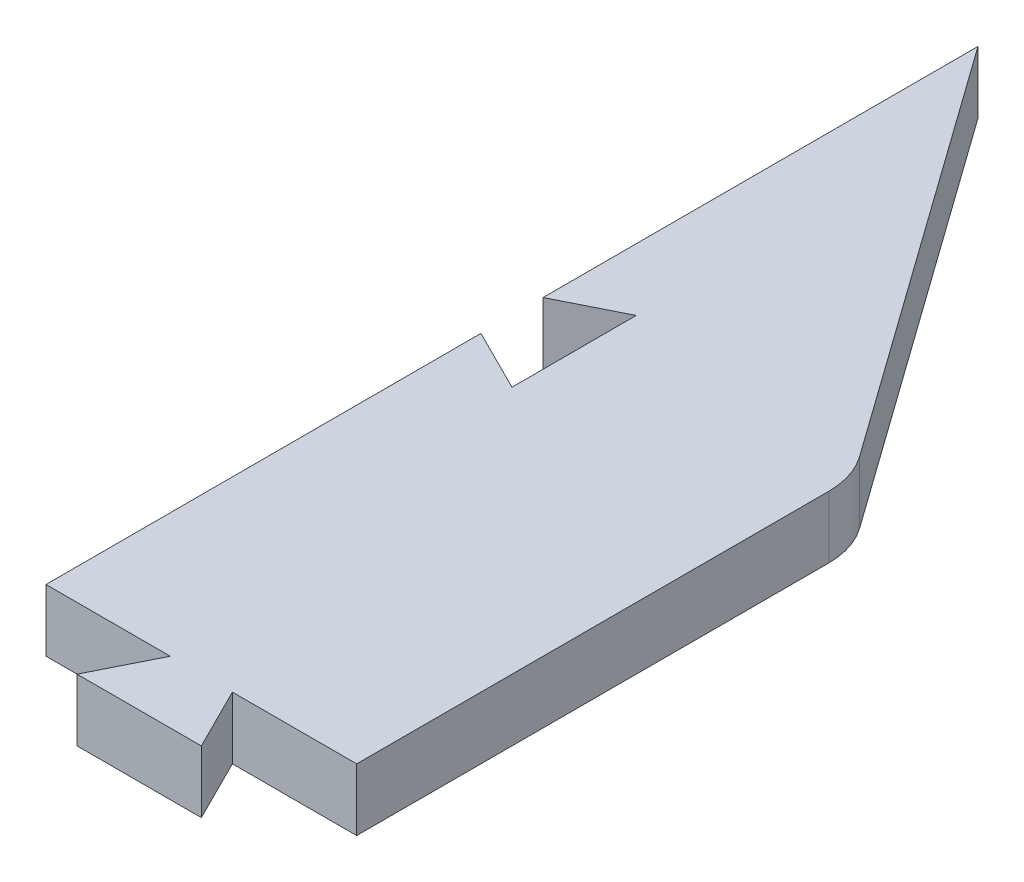
ISO-10303-21;
HEADER;
FILE_DESCRIPTION(('STEP AP214'),'2;1');
FILE_NAME('part.step','',(''),(''),'','','');
FILE_SCHEMA(('AUTOMOTIVE_DESIGN { 1 0 10303 214 1 1 1 1 }'));
ENDSEC;
DATA;
#1=APPLICATION_CONTEXT('core data for automotive mechanical design processes');
#2=APPLICATION_PROTOCOL_DEFINITION('international standard','automotive_design',2000,#1);
#3=PRODUCT_CONTEXT('',#1,'mechanical');
#4=PRODUCT('Part','Part','',(#3));
#5=PRODUCT_RELATED_PRODUCT_CATEGORY('part','',(#4));
#6=PRODUCT_DEFINITION_FORMATION('','',#4);
#7=PRODUCT_DEFINITION_CONTEXT('part definition',#1,'design');
#8=PRODUCT_DEFINITION('design','',#6,#7);
#9=PRODUCT_DEFINITION_SHAPE('','',#8);
#10=(LENGTH_UNIT() NAMED_UNIT(*) SI_UNIT(.MILLI.,.METRE.));
#11=(NAMED_UNIT(*) PLANE_ANGLE_UNIT() SI_UNIT($,.RADIAN.));
#12=(NAMED_UNIT(*) SI_UNIT($,.STERADIAN.) SOLID_ANGLE_UNIT());
#13=UNCERTAINTY_MEASURE_WITH_UNIT(LENGTH_MEASURE(1.E-05),#10,'distance_accuracy_value','');
#14=(GEOMETRIC_REPRESENTATION_CONTEXT(3) GLOBAL_UNCERTAINTY_ASSIGNED_CONTEXT((#13)) GLOBAL_UNIT_ASSIGNED_CONTEXT((#10,
#11,#12)) REPRESENTATION_CONTEXT('',''));
#15=CARTESIAN_POINT('',(0.,0.,0.));
#16=DIRECTION('',(0.,0.,1.));
#17=DIRECTION('',(1.,0.,0.));
#18=AXIS2_PLACEMENT_3D('',#15,#16,#17);
#19=CARTESIAN_POINT('',(14.,4.,-16.5000000000001));
#20=DIRECTION('',(0.447213595499949,0.,0.89442719099992));
#21=DIRECTION('',(0.89442719099992,0.,-0.447213595499949));
#22=AXIS2_PLACEMENT_3D('',#19,#20,#21);
#23=PLANE('',#22);
#24=DIRECTION('',(-0.89442719099992,0.,0.447213595499949));
#25=VECTOR('',#24,1.);
#26=CARTESIAN_POINT('',(14.,0.,-16.5000000000001));
#27=LINE('',#26,#25);
#28=CARTESIAN_POINT('',(14.,0.,-16.5000000000001));
#29=VERTEX_POINT('',#28);
#30=CARTESIAN_POINT('',(9.99999999999999,0.,-14.5000000000001));
#31=VERTEX_POINT('',#30);
#32=EDGE_CURVE('E164',#29,#31,#27,.T.);
#33=ORIENTED_EDGE('',*,*,#32,.F.);
#34=DIRECTION('',(0.,-1.,0.));
#35=VECTOR('',#34,1.);
#36=CARTESIAN_POINT('',(14.,4.,-16.5000000000001));
#37=LINE('',#36,#35);
#38=CARTESIAN_POINT('',(14.,4.,-16.5000000000001));
#39=VERTEX_POINT('',#38);
#40=EDGE_CURVE('E11',#39,#29,#37,.T.);
#41=ORIENTED_EDGE('',*,*,#40,.F.);
#42=DIRECTION('',(-0.89442719099992,0.,0.447213595499949));
#43=VECTOR('',#42,1.);
#44=CARTESIAN_POINT('',(14.,4.,-16.5000000000001));
#45=LINE('',#44,#43);
#46=CARTESIAN_POINT('',(9.99999999999999,4.,-14.5000000000001));
#47=VERTEX_POINT('',#46);
#48=EDGE_CURVE('E193',#39,#47,#45,.T.);
#49=ORIENTED_EDGE('',*,*,#48,.T.);
#50=DIRECTION('',(0.,-1.,0.));
#51=VECTOR('',#50,1.);
#52=CARTESIAN_POINT('',(9.99999999999999,4.,-14.5000000000001));
#53=LINE('',#52,#51);
#54=EDGE_CURVE('E38',#47,#31,#53,.T.);
#55=ORIENTED_EDGE('',*,*,#54,.T.);
#56=EDGE_LOOP('',(#33,#41,#49,#55));
#57=FACE_BOUND('',#56,.T.);
#58=ADVANCED_FACE('F35',(#57),#23,.T.);
#59=CARTESIAN_POINT('',(14.,4.,-16.5000000000001));
#60=DIRECTION('',(1.,0.,0.));
#61=DIRECTION('',(0.,0.,-1.));
#62=AXIS2_PLACEMENT_3D('',#59,#60,#61);
#63=PLANE('',#62);
#64=DIRECTION('',(0.,0.,1.));
#65=VECTOR('',#64,1.);
#66=CARTESIAN_POINT('',(14.,0.,-16.5000000000001));
#67=LINE('',#66,#65);
#68=CARTESIAN_POINT('',(14.,0.,-8.49999999999993));
#69=VERTEX_POINT('',#68);
#70=EDGE_CURVE('E95',#29,#69,#67,.T.);
#71=ORIENTED_EDGE('',*,*,#70,.T.);
#72=DIRECTION('',(0.,-1.,0.));
#73=VECTOR('',#72,1.);
#74=CARTESIAN_POINT('',(14.,4.,-8.49999999999993));
#75=LINE('',#74,#73);
#76=CARTESIAN_POINT('',(14.,4.,-8.49999999999993));
#77=VERTEX_POINT('',#76);
#78=EDGE_CURVE('E44',#77,#69,#75,.T.);
#79=ORIENTED_EDGE('',*,*,#78,.F.);
#80=DIRECTION('',(0.,0.,1.));
#81=VECTOR('',#80,1.);
#82=CARTESIAN_POINT('',(14.,4.,-16.5000000000001));
#83=LINE('',#82,#81);
#84=EDGE_CURVE('E143',#39,#77,#83,.T.);
#85=ORIENTED_EDGE('',*,*,#84,.F.);
#86=ORIENTED_EDGE('',*,*,#40,.T.);
#87=EDGE_LOOP('',(#71,#79,#85,#86));
#88=FACE_BOUND('',#87,.T.);
#89=ADVANCED_FACE('F280',(#88),#63,.F.);
#90=CARTESIAN_POINT('',(14.,4.,-8.49999999999993));
#91=DIRECTION('',(-0.447213595499968,0.,0.894427190999911));
#92=DIRECTION('',(0.894427190999911,0.,0.447213595499968));
#93=AXIS2_PLACEMENT_3D('',#90,#91,#92);
#94=PLANE('',#93);
#95=DIRECTION('',(-0.894427190999911,0.,-0.447213595499968));
#96=VECTOR('',#95,1.);
#97=CARTESIAN_POINT('',(14.,0.,-8.49999999999993));
#98=LINE('',#97,#96);
#99=CARTESIAN_POINT('',(9.99999999999999,0.,-10.5));
#100=VERTEX_POINT('',#99);
#101=EDGE_CURVE('E150',#69,#100,#98,.T.);
#102=ORIENTED_EDGE('',*,*,#101,.T.);
#103=DIRECTION('',(0.,-1.,0.));
#104=VECTOR('',#103,1.);
#105=CARTESIAN_POINT('',(9.99999999999999,4.,-10.5));
#106=LINE('',#105,#104);
#107=CARTESIAN_POINT('',(9.99999999999999,4.,-10.5));
#108=VERTEX_POINT('',#107);
#109=EDGE_CURVE('E147',#108,#100,#106,.T.);
#110=ORIENTED_EDGE('',*,*,#109,.F.);
#111=DIRECTION('',(-0.894427190999911,0.,-0.447213595499968));
#112=VECTOR('',#111,1.);
#113=CARTESIAN_POINT('',(14.,4.,-8.49999999999993));
#114=LINE('',#113,#112);
#115=EDGE_CURVE('E135',#77,#108,#114,.T.);
#116=ORIENTED_EDGE('',*,*,#115,.F.);
#117=ORIENTED_EDGE('',*,*,#78,.T.);
#118=EDGE_LOOP('',(#102,#110,#116,#117));
#119=FACE_BOUND('',#118,.T.);
#120=ADVANCED_FACE('F148',(#119),#94,.F.);
#121=CARTESIAN_POINT('',(10.,4.,17.5));
#122=DIRECTION('',(-1.,0.,0.));
#123=DIRECTION('',(0.,0.,1.));
#124=AXIS2_PLACEMENT_3D('',#121,#122,#123);
#125=PLANE('',#124);
#126=DIRECTION('',(0.,0.,-1.));
#127=VECTOR('',#126,1.);
#128=CARTESIAN_POINT('',(10.,0.,17.5));
#129=LINE('',#128,#127);
#130=CARTESIAN_POINT('',(10.,0.,17.5));
#131=VERTEX_POINT('',#130);
#132=EDGE_CURVE('E190',#131,#100,#129,.T.);
#133=ORIENTED_EDGE('',*,*,#132,.F.);
#134=DIRECTION('',(0.,-1.,0.));
#135=VECTOR('',#134,1.);
#136=CARTESIAN_POINT('',(10.,4.,17.5));
#137=LINE('',#136,#135);
#138=CARTESIAN_POINT('',(10.,4.,17.5));
#139=VERTEX_POINT('',#138);
#140=EDGE_CURVE('E154',#139,#131,#137,.T.);
#141=ORIENTED_EDGE('',*,*,#140,.F.);
#142=DIRECTION('',(0.,0.,-1.));
#143=VECTOR('',#142,1.);
#144=CARTESIAN_POINT('',(10.,4.,17.5));
#145=LINE('',#144,#143);
#146=EDGE_CURVE('E141',#139,#108,#145,.T.);
#147=ORIENTED_EDGE('',*,*,#146,.T.);
#148=ORIENTED_EDGE('',*,*,#109,.T.);
#149=EDGE_LOOP('',(#133,#141,#147,#148));
#150=FACE_BOUND('',#149,.T.);
#151=ADVANCED_FACE('F156',(#150),#125,.T.);
#152=CARTESIAN_POINT('',(18.,4.,17.5));
#153=DIRECTION('',(0.,0.,1.));
#154=DIRECTION('',(1.,0.,0.));
#155=AXIS2_PLACEMENT_3D('',#152,#153,#154);
#156=PLANE('',#155);
#157=DIRECTION('',(-1.,0.,0.));
#158=VECTOR('',#157,1.);
#159=CARTESIAN_POINT('',(18.,0.,17.5));
#160=LINE('',#159,#158);
#161=CARTESIAN_POINT('',(18.,0.,17.5));
#162=VERTEX_POINT('',#161);
#163=EDGE_CURVE('E187',#162,#131,#160,.T.);
#164=ORIENTED_EDGE('',*,*,#163,.F.);
#165=DIRECTION('',(0.,-1.,0.));
#166=VECTOR('',#165,1.);
#167=CARTESIAN_POINT('',(18.,4.,17.5));
#168=LINE('',#167,#166);
#169=CARTESIAN_POINT('',(18.,4.,17.5));
#170=VERTEX_POINT('',#169);
#171=EDGE_CURVE('E197',#170,#162,#168,.T.);
#172=ORIENTED_EDGE('',*,*,#171,.F.);
#173=DIRECTION('',(-1.,0.,0.));
#174=VECTOR('',#173,1.);
#175=CARTESIAN_POINT('',(18.,4.,17.5));
#176=LINE('',#175,#174);
#177=EDGE_CURVE('E157',#170,#139,#176,.T.);
#178=ORIENTED_EDGE('',*,*,#177,.T.);
#179=ORIENTED_EDGE('',*,*,#140,.T.);
#180=EDGE_LOOP('',(#164,#172,#178,#179));
#181=FACE_BOUND('',#180,.T.);
#182=ADVANCED_FACE('F223',(#181),#156,.T.);
#183=CARTESIAN_POINT('',(16.,4.,21.5));
#184=DIRECTION('',(-0.894427190999916,0.,-0.447213595499958));
#185=DIRECTION('',(-0.447213595499958,0.,0.894427190999916));
#186=AXIS2_PLACEMENT_3D('',#183,#184,#185);
#187=PLANE('',#186);
#188=DIRECTION('',(0.447213595499958,0.,-0.894427190999916));
#189=VECTOR('',#188,1.);
#190=CARTESIAN_POINT('',(16.,0.,21.5));
#191=LINE('',#190,#189);
#192=CARTESIAN_POINT('',(16.,0.,21.5));
#193=VERTEX_POINT('',#192);
#194=EDGE_CURVE('E184',#193,#162,#191,.T.);
#195=ORIENTED_EDGE('',*,*,#194,.F.);
#196=DIRECTION('',(0.,-1.,0.));
#197=VECTOR('',#196,1.);
#198=CARTESIAN_POINT('',(16.,4.,21.5));
#199=LINE('',#198,#197);
#200=CARTESIAN_POINT('',(16.,4.,21.5));
#201=VERTEX_POINT('',#200);
#202=EDGE_CURVE('E199',#201,#193,#199,.T.);
#203=ORIENTED_EDGE('',*,*,#202,.F.);
#204=DIRECTION('',(0.447213595499958,0.,-0.894427190999916));
#205=VECTOR('',#204,1.);
#206=CARTESIAN_POINT('',(16.,4.,21.5));
#207=LINE('',#206,#205);
#208=EDGE_CURVE('E159',#201,#170,#207,.T.);
#209=ORIENTED_EDGE('',*,*,#208,.T.);
#210=ORIENTED_EDGE('',*,*,#171,.T.);
#211=EDGE_LOOP('',(#195,#203,#209,#210));
#212=FACE_BOUND('',#211,.T.);
#213=ADVANCED_FACE('F229',(#212),#187,.T.);
#214=CARTESIAN_POINT('',(24.,4.,21.5));
#215=DIRECTION('',(0.,0.,1.));
#216=DIRECTION('',(1.,0.,0.));
#217=AXIS2_PLACEMENT_3D('',#214,#215,#216);
#218=PLANE('',#217);
#219=DIRECTION('',(-1.,0.,0.));
#220=VECTOR('',#219,1.);
#221=CARTESIAN_POINT('',(24.,0.,21.5));
#222=LINE('',#221,#220);
#223=CARTESIAN_POINT('',(24.,0.,21.5));
#224=VERTEX_POINT('',#223);
#225=EDGE_CURVE('E181',#224,#193,#222,.T.);
#226=ORIENTED_EDGE('',*,*,#225,.F.);
#227=DIRECTION('',(0.,-1.,0.));
#228=VECTOR('',#227,1.);
#229=CARTESIAN_POINT('',(24.,4.,21.5));
#230=LINE('',#229,#228);
#231=CARTESIAN_POINT('',(24.,4.,21.5));
#232=VERTEX_POINT('',#231);
#233=EDGE_CURVE('E201',#232,#224,#230,.T.);
#234=ORIENTED_EDGE('',*,*,#233,.F.);
#235=DIRECTION('',(-1.,0.,0.));
#236=VECTOR('',#235,1.);
#237=CARTESIAN_POINT('',(24.,4.,21.5));
#238=LINE('',#237,#236);
#239=EDGE_CURVE('E230',#232,#201,#238,.T.);
#240=ORIENTED_EDGE('',*,*,#239,.T.);
#241=ORIENTED_EDGE('',*,*,#202,.T.);
#242=EDGE_LOOP('',(#226,#234,#240,#241));
#243=FACE_BOUND('',#242,.T.);
#244=ADVANCED_FACE('F268',(#243),#218,.T.);
#245=CARTESIAN_POINT('',(24.,4.,21.5));
#246=DIRECTION('',(-0.894427190999916,0.,0.447213595499958));
#247=DIRECTION('',(0.447213595499958,0.,0.894427190999916));
#248=AXIS2_PLACEMENT_3D('',#245,#246,#247);
#249=PLANE('',#248);
#250=DIRECTION('',(-0.447213595499958,0.,-0.894427190999916));
#251=VECTOR('',#250,1.);
#252=CARTESIAN_POINT('',(24.,0.,21.5));
#253=LINE('',#252,#251);
#254=CARTESIAN_POINT('',(22.,0.,17.5));
#255=VERTEX_POINT('',#254);
#256=EDGE_CURVE('E179',#224,#255,#253,.T.);
#257=ORIENTED_EDGE('',*,*,#256,.T.);
#258=DIRECTION('',(0.,-1.,0.));
#259=VECTOR('',#258,1.);
#260=CARTESIAN_POINT('',(22.,4.,17.5));
#261=LINE('',#260,#259);
#262=CARTESIAN_POINT('',(22.,4.,17.5));
#263=VERTEX_POINT('',#262);
#264=EDGE_CURVE('E203',#263,#255,#261,.T.);
#265=ORIENTED_EDGE('',*,*,#264,.F.);
#266=DIRECTION('',(-0.447213595499958,0.,-0.894427190999916));
#267=VECTOR('',#266,1.);
#268=CARTESIAN_POINT('',(24.,4.,21.5));
#269=LINE('',#268,#267);
#270=EDGE_CURVE('E231',#232,#263,#269,.T.);
#271=ORIENTED_EDGE('',*,*,#270,.F.);
#272=ORIENTED_EDGE('',*,*,#233,.T.);
#273=EDGE_LOOP('',(#257,#265,#271,#272));
#274=FACE_BOUND('',#273,.T.);
#275=ADVANCED_FACE('F270',(#274),#249,.F.);
#276=CARTESIAN_POINT('',(22.,4.,17.5));
#277=DIRECTION('',(0.,0.,-1.));
#278=DIRECTION('',(-1.,0.,0.));
#279=AXIS2_PLACEMENT_3D('',#276,#277,#278);
#280=PLANE('',#279);
#281=DIRECTION('',(1.,0.,0.));
#282=VECTOR('',#281,1.);
#283=CARTESIAN_POINT('',(22.,0.,17.5));
#284=LINE('',#283,#282);
#285=CARTESIAN_POINT('',(30.,0.,17.5));
#286=VERTEX_POINT('',#285);
#287=EDGE_CURVE('E177',#255,#286,#284,.T.);
#288=ORIENTED_EDGE('',*,*,#287,.T.);
#289=DIRECTION('',(0.,-1.,0.));
#290=VECTOR('',#289,1.);
#291=CARTESIAN_POINT('',(30.,4.,17.5));
#292=LINE('',#291,#290);
#293=CARTESIAN_POINT('',(30.,4.,17.5));
#294=VERTEX_POINT('',#293);
#295=EDGE_CURVE('E206',#294,#286,#292,.T.);
#296=ORIENTED_EDGE('',*,*,#295,.F.);
#297=DIRECTION('',(1.,0.,0.));
#298=VECTOR('',#297,1.);
#299=CARTESIAN_POINT('',(22.,4.,17.5));
#300=LINE('',#299,#298);
#301=EDGE_CURVE('E235',#263,#294,#300,.T.);
#302=ORIENTED_EDGE('',*,*,#301,.F.);
#303=ORIENTED_EDGE('',*,*,#264,.T.);
#304=EDGE_LOOP('',(#288,#296,#302,#303));
#305=FACE_BOUND('',#304,.T.);
#306=ADVANCED_FACE('F262',(#305),#280,.F.);
#307=CARTESIAN_POINT('',(30.,4.,17.5));
#308=DIRECTION('',(-1.,0.,0.));
#309=DIRECTION('',(0.,0.,1.));
#310=AXIS2_PLACEMENT_3D('',#307,#308,#309);
#311=PLANE('',#310);
#312=DIRECTION('',(0.,0.,-1.));
#313=VECTOR('',#312,1.);
#314=CARTESIAN_POINT('',(30.,0.,17.5));
#315=LINE('',#314,#313);
#316=CARTESIAN_POINT('',(30.,0.,-12.8976747329574));
#317=VERTEX_POINT('',#316);
#318=EDGE_CURVE('E175',#286,#317,#315,.T.);
#319=ORIENTED_EDGE('',*,*,#318,.T.);
#320=DIRECTION('',(0.,-1.,0.));
#321=VECTOR('',#320,1.);
#322=CARTESIAN_POINT('',(30.,4.,-12.8976747329574));
#323=LINE('',#322,#321);
#324=CARTESIAN_POINT('',(30.,4.,-12.8976747329574));
#325=VERTEX_POINT('',#324);
#326=EDGE_CURVE('E209',#325,#317,#323,.T.);
#327=ORIENTED_EDGE('',*,*,#326,.F.);
#328=DIRECTION('',(0.,0.,-1.));
#329=VECTOR('',#328,1.);
#330=CARTESIAN_POINT('',(30.,4.,17.5));
#331=LINE('',#330,#329);
#332=EDGE_CURVE('E237',#294,#325,#331,.T.);
#333=ORIENTED_EDGE('',*,*,#332,.F.);
#334=ORIENTED_EDGE('',*,*,#295,.T.);
#335=EDGE_LOOP('',(#319,#327,#333,#334));
#336=FACE_BOUND('',#335,.T.);
#337=ADVANCED_FACE('F258',(#336),#311,.F.);
#338=CARTESIAN_POINT('',(25.,4.,-12.8976747329575));
#339=DIRECTION('',(0.,-1.,0.));
#340=DIRECTION('',(0.,0.,-1.));
#341=AXIS2_PLACEMENT_3D('',#338,#339,#340);
#342=CYLINDRICAL_SURFACE('',#341,5.);
#343=CARTESIAN_POINT('',(25.,0.,-12.8976747329575));
#344=DIRECTION('',(0.,1.,0.));
#345=DIRECTION('',(0.,0.,1.));
#346=AXIS2_PLACEMENT_3D('',#343,#344,#345);
#347=CIRCLE('',#346,5.);
#348=CARTESIAN_POINT('',(29.0686673560337,0.,-15.803865701553));
#349=VERTEX_POINT('',#348);
#350=EDGE_CURVE('E173',#317,#349,#347,.T.);
#351=ORIENTED_EDGE('',*,*,#350,.T.);
#352=DIRECTION('',(0.,-1.,0.));
#353=VECTOR('',#352,1.);
#354=CARTESIAN_POINT('',(29.0686673560337,4.,-15.803865701553));
#355=LINE('',#354,#353);
#356=CARTESIAN_POINT('',(29.0686673560337,4.,-15.803865701553));
#357=VERTEX_POINT('',#356);
#358=EDGE_CURVE('E212',#357,#349,#355,.T.);
#359=ORIENTED_EDGE('',*,*,#358,.F.);
#360=CARTESIAN_POINT('',(25.,4.,-12.8976747329575));
#361=DIRECTION('',(0.,1.,0.));
#362=DIRECTION('',(0.,0.,1.));
#363=AXIS2_PLACEMENT_3D('',#360,#361,#362);
#364=CIRCLE('',#363,5.);
#365=EDGE_CURVE('E239',#325,#357,#364,.T.);
#366=ORIENTED_EDGE('',*,*,#365,.F.);
#367=ORIENTED_EDGE('',*,*,#326,.T.);
#368=EDGE_LOOP('',(#351,#359,#366,#367));
#369=FACE_BOUND('',#368,.T.);
#370=ADVANCED_FACE('F254',(#369),#342,.T.);
#371=CARTESIAN_POINT('',(29.0686673560337,4.,-15.803865701553));
#372=DIRECTION('',(-0.813733471206734,0.,0.581238193719098));
#373=DIRECTION('',(0.581238193719098,0.,0.813733471206734));
#374=AXIS2_PLACEMENT_3D('',#371,#372,#373);
#375=PLANE('',#374);
#376=DIRECTION('',(-0.581238193719098,0.,-0.813733471206734));
#377=VECTOR('',#376,1.);
#378=CARTESIAN_POINT('',(29.0686673560337,0.,-15.803865701553));
#379=LINE('',#378,#377);
#380=CARTESIAN_POINT('',(10.,0.,-42.5));
#381=VERTEX_POINT('',#380);
#382=EDGE_CURVE('E170',#349,#381,#379,.T.);
#383=ORIENTED_EDGE('',*,*,#382,.T.);
#384=DIRECTION('',(0.,-1.,0.));
#385=VECTOR('',#384,1.);
#386=CARTESIAN_POINT('',(10.,4.,-42.5));
#387=LINE('',#386,#385);
#388=CARTESIAN_POINT('',(10.,4.,-42.5));
#389=VERTEX_POINT('',#388);
#390=EDGE_CURVE('E214',#389,#381,#387,.T.);
#391=ORIENTED_EDGE('',*,*,#390,.F.);
#392=DIRECTION('',(-0.581238193719098,0.,-0.813733471206734));
#393=VECTOR('',#392,1.);
#394=CARTESIAN_POINT('',(29.0686673560337,4.,-15.803865701553));
#395=LINE('',#394,#393);
#396=EDGE_CURVE('E241',#357,#389,#395,.T.);
#397=ORIENTED_EDGE('',*,*,#396,.F.);
#398=ORIENTED_EDGE('',*,*,#358,.T.);
#399=EDGE_LOOP('',(#383,#391,#397,#398));
#400=FACE_BOUND('',#399,.T.);
#401=ADVANCED_FACE('F249',(#400),#375,.F.);
#402=CARTESIAN_POINT('',(9.99999999999999,4.,-14.5000000000001));
#403=DIRECTION('',(-1.,0.,0.));
#404=DIRECTION('',(0.,0.,1.));
#405=AXIS2_PLACEMENT_3D('',#402,#403,#404);
#406=PLANE('',#405);
#407=DIRECTION('',(0.,0.,-1.));
#408=VECTOR('',#407,1.);
#409=CARTESIAN_POINT('',(9.99999999999999,0.,-14.5000000000001));
#410=LINE('',#409,#408);
#411=EDGE_CURVE('E167',#31,#381,#410,.T.);
#412=ORIENTED_EDGE('',*,*,#411,.F.);
#413=ORIENTED_EDGE('',*,*,#54,.F.);
#414=DIRECTION('',(0.,0.,-1.));
#415=VECTOR('',#414,1.);
#416=CARTESIAN_POINT('',(9.99999999999999,4.,-14.5000000000001));
#417=LINE('',#416,#415);
#418=EDGE_CURVE('E243',#47,#389,#417,.T.);
#419=ORIENTED_EDGE('',*,*,#418,.T.);
#420=ORIENTED_EDGE('',*,*,#390,.T.);
#421=EDGE_LOOP('',(#412,#413,#419,#420));
#422=FACE_BOUND('',#421,.T.);
#423=ADVANCED_FACE('F216',(#422),#406,.T.);
#424=CARTESIAN_POINT('',(25.,4.,-12.8976747329575));
#425=DIRECTION('',(0.,1.,0.));
#426=DIRECTION('',(0.,0.,1.));
#427=AXIS2_PLACEMENT_3D('',#424,#425,#426);
#428=PLANE('',#427);
#429=ORIENTED_EDGE('',*,*,#48,.F.);
#430=ORIENTED_EDGE('',*,*,#84,.T.);
#431=ORIENTED_EDGE('',*,*,#115,.T.);
#432=ORIENTED_EDGE('',*,*,#146,.F.);
#433=ORIENTED_EDGE('',*,*,#177,.F.);
#434=ORIENTED_EDGE('',*,*,#208,.F.);
#435=ORIENTED_EDGE('',*,*,#239,.F.);
#436=ORIENTED_EDGE('',*,*,#270,.T.);
#437=ORIENTED_EDGE('',*,*,#301,.T.);
#438=ORIENTED_EDGE('',*,*,#332,.T.);
#439=ORIENTED_EDGE('',*,*,#365,.T.);
#440=ORIENTED_EDGE('',*,*,#396,.T.);
#441=ORIENTED_EDGE('',*,*,#418,.F.);
#442=EDGE_LOOP('',(#429,#430,#431,#432,#433,#434,#435,#436,#437,#438,#439,#440,#441));
#443=FACE_BOUND('',#442,.T.);
#444=ADVANCED_FACE('F138',(#443),#428,.T.);
#445=CARTESIAN_POINT('',(25.,0.,-12.8976747329575));
#446=DIRECTION('',(0.,1.,0.));
#447=DIRECTION('',(0.,0.,1.));
#448=AXIS2_PLACEMENT_3D('',#445,#446,#447);
#449=PLANE('',#448);
#450=ORIENTED_EDGE('',*,*,#32,.T.);
#451=ORIENTED_EDGE('',*,*,#411,.T.);
#452=ORIENTED_EDGE('',*,*,#382,.F.);
#453=ORIENTED_EDGE('',*,*,#350,.F.);
#454=ORIENTED_EDGE('',*,*,#318,.F.);
#455=ORIENTED_EDGE('',*,*,#287,.F.);
#456=ORIENTED_EDGE('',*,*,#256,.F.);
#457=ORIENTED_EDGE('',*,*,#225,.T.);
#458=ORIENTED_EDGE('',*,*,#194,.T.);
#459=ORIENTED_EDGE('',*,*,#163,.T.);
#460=ORIENTED_EDGE('',*,*,#132,.T.);
#461=ORIENTED_EDGE('',*,*,#101,.F.);
#462=ORIENTED_EDGE('',*,*,#70,.F.);
#463=EDGE_LOOP('',(#450,#451,#452,#453,#454,#455,#456,#457,#458,#459,#460,#461,#462));
#464=FACE_BOUND('',#463,.T.);
#465=ADVANCED_FACE('F219',(#464),#449,.F.);
#466=CLOSED_SHELL('',(#58,#89,#120,#151,#182,#213,#244,#275,#306,#337,#370,#401,#423,#444,#465));
#467=MANIFOLD_SOLID_BREP('B2',#466);
#468=ADVANCED_BREP_SHAPE_REPRESENTATION('',(#18,#467),#14);
#469=SHAPE_DEFINITION_REPRESENTATION(#9,#468);
ENDSEC;
END-ISO-10303-21;
